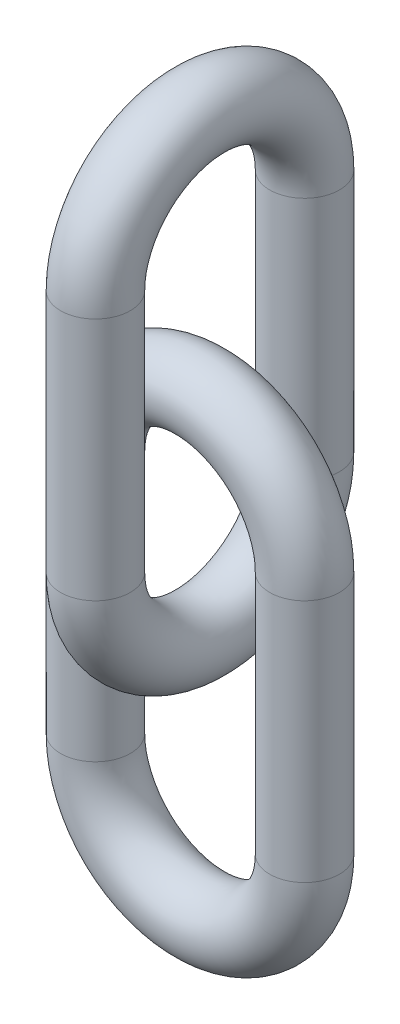
ISO-10303-21;
HEADER;
FILE_DESCRIPTION(('STEP AP214'),'2;1');
FILE_NAME('part.step','',(''),(''),'','','');
FILE_SCHEMA(('AUTOMOTIVE_DESIGN { 1 0 10303 214 1 1 1 1 }'));
ENDSEC;
DATA;
#1=APPLICATION_CONTEXT('core data for automotive mechanical design processes');
#2=APPLICATION_PROTOCOL_DEFINITION('international standard','automotive_design',2000,#1);
#3=PRODUCT_CONTEXT('',#1,'mechanical');
#4=PRODUCT('Part','Part','',(#3));
#5=PRODUCT_RELATED_PRODUCT_CATEGORY('part','',(#4));
#6=PRODUCT_DEFINITION_FORMATION('','',#4);
#7=PRODUCT_DEFINITION_CONTEXT('part definition',#1,'design');
#8=PRODUCT_DEFINITION('design','',#6,#7);
#9=PRODUCT_DEFINITION_SHAPE('','',#8);
#10=(LENGTH_UNIT() NAMED_UNIT(*) SI_UNIT(.MILLI.,.METRE.));
#11=(NAMED_UNIT(*) PLANE_ANGLE_UNIT() SI_UNIT($,.RADIAN.));
#12=(NAMED_UNIT(*) SI_UNIT($,.STERADIAN.) SOLID_ANGLE_UNIT());
#13=UNCERTAINTY_MEASURE_WITH_UNIT(LENGTH_MEASURE(1.E-05),#10,'distance_accuracy_value','');
#14=(GEOMETRIC_REPRESENTATION_CONTEXT(3) GLOBAL_UNCERTAINTY_ASSIGNED_CONTEXT((#13)) GLOBAL_UNIT_ASSIGNED_CONTEXT((#10,
#11,#12)) REPRESENTATION_CONTEXT('',''));
#15=CARTESIAN_POINT('',(0.,0.,0.));
#16=DIRECTION('',(0.,0.,1.));
#17=DIRECTION('',(1.,0.,0.));
#18=AXIS2_PLACEMENT_3D('',#15,#16,#17);
#19=CARTESIAN_POINT('',(0.,-210.,-60.));
#20=DIRECTION('',(0.,0.,-1.));
#21=DIRECTION('',(-1.,0.,0.));
#22=AXIS2_PLACEMENT_3D('',#19,#20,#21);
#23=TOROIDAL_SURFACE('',#22,60.,20.);
#24=CARTESIAN_POINT('',(60.,-210.,-60.));
#25=DIRECTION('',(0.,1.,0.));
#26=DIRECTION('',(-1.,0.,0.));
#27=AXIS2_PLACEMENT_3D('',#24,#25,#26);
#28=CIRCLE('',#27,20.);
#29=CARTESIAN_POINT('',(80.,-210.,-60.));
#30=VERTEX_POINT('',#29);
#31=EDGE_CURVE('E91',#30,#30,#28,.T.);
#32=CARTESIAN_POINT('',(-60.,-210.,-60.));
#33=DIRECTION('',(0.,-1.,0.));
#34=DIRECTION('',(1.,0.,0.));
#35=AXIS2_PLACEMENT_3D('',#32,#33,#34);
#36=CIRCLE('',#35,20.);
#37=CARTESIAN_POINT('',(-80.,-210.,-60.));
#38=VERTEX_POINT('',#37);
#39=EDGE_CURVE('E86',#38,#38,#36,.T.);
#40=CARTESIAN_POINT('',(0.,-210.,-60.));
#41=DIRECTION('',(0.,0.,-1.));
#42=DIRECTION('',(-1.,0.,0.));
#43=AXIS2_PLACEMENT_3D('',#40,#41,#42);
#44=CIRCLE('',#43,80.);
#45=EDGE_CURVE('',#30,#38,#44,.T.);
#46=ORIENTED_EDGE('',*,*,#31,.F.);
#47=ORIENTED_EDGE('',*,*,#39,.T.);
#48=ORIENTED_EDGE('',*,*,#45,.T.);
#49=ORIENTED_EDGE('',*,*,#45,.F.);
#50=EDGE_LOOP('',(#46,#48,#47,#49));
#51=FACE_BOUND('',#50,.T.);
#52=ADVANCED_FACE('F73',(#51),#23,.T.);
#53=CARTESIAN_POINT('',(-60.,-210.,-60.));
#54=DIRECTION('',(0.,1.,0.));
#55=DIRECTION('',(-1.,0.,0.));
#56=AXIS2_PLACEMENT_3D('',#53,#54,#55);
#57=CYLINDRICAL_SURFACE('',#56,20.);
#58=CARTESIAN_POINT('',(-60.,-70.,-60.));
#59=DIRECTION('',(0.,-1.,0.));
#60=DIRECTION('',(1.,0.,0.));
#61=AXIS2_PLACEMENT_3D('',#58,#59,#60);
#62=CIRCLE('',#61,20.);
#63=CARTESIAN_POINT('',(-80.,-70.,-60.));
#64=VERTEX_POINT('',#63);
#65=EDGE_CURVE('E83',#64,#64,#62,.T.);
#66=ORIENTED_EDGE('',*,*,#65,.T.);
#67=EDGE_LOOP('',(#66));
#68=FACE_BOUND('',#67,.T.);
#69=ORIENTED_EDGE('',*,*,#39,.F.);
#70=EDGE_LOOP('',(#69));
#71=FACE_BOUND('',#70,.T.);
#72=ADVANCED_FACE('F103',(#68,#71),#57,.T.);
#73=CARTESIAN_POINT('',(0.,-70.,-60.));
#74=DIRECTION('',(0.,0.,-1.));
#75=DIRECTION('',(-1.,0.,0.));
#76=AXIS2_PLACEMENT_3D('',#73,#74,#75);
#77=TOROIDAL_SURFACE('',#76,60.,20.);
#78=CARTESIAN_POINT('',(60.,-70.,-60.));
#79=DIRECTION('',(0.,1.,0.));
#80=DIRECTION('',(-1.,0.,0.));
#81=AXIS2_PLACEMENT_3D('',#78,#79,#80);
#82=CIRCLE('',#81,20.);
#83=CARTESIAN_POINT('',(80.,-70.,-60.));
#84=VERTEX_POINT('',#83);
#85=EDGE_CURVE('E12',#84,#84,#82,.T.);
#86=CARTESIAN_POINT('',(0.,-70.,-60.));
#87=DIRECTION('',(0.,0.,-1.));
#88=DIRECTION('',(-1.,0.,0.));
#89=AXIS2_PLACEMENT_3D('',#86,#87,#88);
#90=CIRCLE('',#89,80.);
#91=EDGE_CURVE('',#64,#84,#90,.T.);
#92=ORIENTED_EDGE('',*,*,#65,.F.);
#93=ORIENTED_EDGE('',*,*,#85,.T.);
#94=ORIENTED_EDGE('',*,*,#91,.T.);
#95=ORIENTED_EDGE('',*,*,#91,.F.);
#96=EDGE_LOOP('',(#92,#94,#93,#95));
#97=FACE_BOUND('',#96,.T.);
#98=ADVANCED_FACE('F108',(#97),#77,.T.);
#99=CARTESIAN_POINT('',(60.,-70.,-60.));
#100=DIRECTION('',(0.,-1.,0.));
#101=DIRECTION('',(1.,0.,0.));
#102=AXIS2_PLACEMENT_3D('',#99,#100,#101);
#103=CYLINDRICAL_SURFACE('',#102,20.);
#104=ORIENTED_EDGE('',*,*,#31,.T.);
#105=EDGE_LOOP('',(#104));
#106=FACE_BOUND('',#105,.T.);
#107=ORIENTED_EDGE('',*,*,#85,.F.);
#108=EDGE_LOOP('',(#107));
#109=FACE_BOUND('',#108,.T.);
#110=ADVANCED_FACE('F79',(#106,#109),#103,.T.);
#111=CLOSED_SHELL('',(#52,#72,#98,#110));
#112=MANIFOLD_SOLID_BREP('B2',#111);
#113=CARTESIAN_POINT('',(0.,70.,-60.));
#114=DIRECTION('',(1.,0.,0.));
#115=DIRECTION('',(0.,0.,-1.));
#116=AXIS2_PLACEMENT_3D('',#113,#114,#115);
#117=TOROIDAL_SURFACE('',#116,60.,20.);
#118=CARTESIAN_POINT('',(0.,70.0000000000001,-120.));
#119=DIRECTION('',(0.,1.,0.));
#120=DIRECTION('',(0.,0.,1.));
#121=AXIS2_PLACEMENT_3D('',#118,#119,#120);
#122=CIRCLE('',#121,20.);
#123=CARTESIAN_POINT('',(0.,70.0000000000001,-140.));
#124=VERTEX_POINT('',#123);
#125=EDGE_CURVE('E74',#124,#124,#122,.T.);
#126=CARTESIAN_POINT('',(0.,70.,0.));
#127=DIRECTION('',(0.,-1.,0.));
#128=DIRECTION('',(0.,0.,-1.));
#129=AXIS2_PLACEMENT_3D('',#126,#127,#128);
#130=CIRCLE('',#129,20.);
#131=CARTESIAN_POINT('',(0.,70.,20.));
#132=VERTEX_POINT('',#131);
#133=EDGE_CURVE('E154',#132,#132,#130,.T.);
#134=CARTESIAN_POINT('',(0.,70.,-60.));
#135=DIRECTION('',(1.,0.,0.));
#136=DIRECTION('',(0.,0.,-1.));
#137=AXIS2_PLACEMENT_3D('',#134,#135,#136);
#138=CIRCLE('',#137,80.);
#139=EDGE_CURVE('',#124,#132,#138,.T.);
#140=ORIENTED_EDGE('',*,*,#125,.T.);
#141=ORIENTED_EDGE('',*,*,#133,.F.);
#142=ORIENTED_EDGE('',*,*,#139,.T.);
#143=ORIENTED_EDGE('',*,*,#139,.F.);
#144=EDGE_LOOP('',(#140,#142,#141,#143));
#145=FACE_BOUND('',#144,.T.);
#146=ADVANCED_FACE('F143',(#145),#117,.T.);
#147=CARTESIAN_POINT('',(0.,-70.,-120.));
#148=DIRECTION('',(0.,1.,0.));
#149=DIRECTION('',(0.,0.,1.));
#150=AXIS2_PLACEMENT_3D('',#147,#148,#149);
#151=CYLINDRICAL_SURFACE('',#150,20.);
#152=ORIENTED_EDGE('',*,*,#125,.F.);
#153=EDGE_LOOP('',(#152));
#154=FACE_BOUND('',#153,.T.);
#155=CARTESIAN_POINT('',(0.,-70.,-120.));
#156=DIRECTION('',(0.,1.,0.));
#157=DIRECTION('',(0.,0.,1.));
#158=AXIS2_PLACEMENT_3D('',#155,#156,#157);
#159=CIRCLE('',#158,20.);
#160=CARTESIAN_POINT('',(0.,-70.,-140.));
#161=VERTEX_POINT('',#160);
#162=EDGE_CURVE('E150',#161,#161,#159,.T.);
#163=ORIENTED_EDGE('',*,*,#162,.T.);
#164=EDGE_LOOP('',(#163));
#165=FACE_BOUND('',#164,.T.);
#166=ADVANCED_FACE('F163',(#154,#165),#151,.T.);
#167=CARTESIAN_POINT('',(0.,-70.,-60.));
#168=DIRECTION('',(1.,0.,0.));
#169=DIRECTION('',(0.,0.,-1.));
#170=AXIS2_PLACEMENT_3D('',#167,#168,#169);
#171=TOROIDAL_SURFACE('',#170,60.,20.);
#172=CARTESIAN_POINT('',(0.,-70.,0.));
#173=DIRECTION('',(0.,-1.,0.));
#174=DIRECTION('',(0.,0.,-1.));
#175=AXIS2_PLACEMENT_3D('',#172,#173,#174);
#176=CIRCLE('',#175,20.);
#177=CARTESIAN_POINT('',(0.,-70.,20.));
#178=VERTEX_POINT('',#177);
#179=EDGE_CURVE('E151',#178,#178,#176,.T.);
#180=CARTESIAN_POINT('',(0.,-70.,-60.));
#181=DIRECTION('',(1.,0.,0.));
#182=DIRECTION('',(0.,0.,-1.));
#183=AXIS2_PLACEMENT_3D('',#180,#181,#182);
#184=CIRCLE('',#183,80.);
#185=EDGE_CURVE('',#178,#161,#184,.T.);
#186=ORIENTED_EDGE('',*,*,#179,.T.);
#187=ORIENTED_EDGE('',*,*,#162,.F.);
#188=ORIENTED_EDGE('',*,*,#185,.T.);
#189=ORIENTED_EDGE('',*,*,#185,.F.);
#190=EDGE_LOOP('',(#186,#188,#187,#189));
#191=FACE_BOUND('',#190,.T.);
#192=ADVANCED_FACE('F169',(#191),#171,.T.);
#193=CARTESIAN_POINT('',(0.,70.,0.));
#194=DIRECTION('',(0.,-1.,0.));
#195=DIRECTION('',(0.,0.,-1.));
#196=AXIS2_PLACEMENT_3D('',#193,#194,#195);
#197=CYLINDRICAL_SURFACE('',#196,20.);
#198=ORIENTED_EDGE('',*,*,#179,.F.);
#199=EDGE_LOOP('',(#198));
#200=FACE_BOUND('',#199,.T.);
#201=ORIENTED_EDGE('',*,*,#133,.T.);
#202=EDGE_LOOP('',(#201));
#203=FACE_BOUND('',#202,.T.);
#204=ADVANCED_FACE('F161',(#200,#203),#197,.T.);
#205=CLOSED_SHELL('',(#146,#166,#192,#204));
#206=MANIFOLD_SOLID_BREP('B7',#205);
#207=ADVANCED_BREP_SHAPE_REPRESENTATION('',(#18,#112,#206),#14);
#208=SHAPE_DEFINITION_REPRESENTATION(#9,#207);
ENDSEC;
END-ISO-10303-21;
